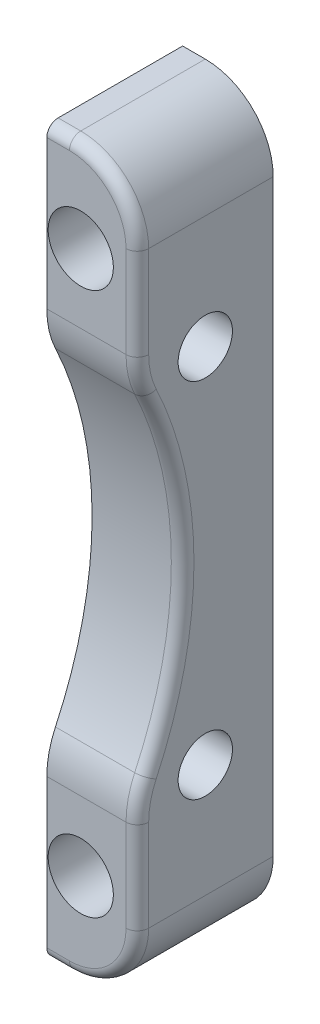
ISO-10303-21;
HEADER;
FILE_DESCRIPTION(('STEP AP214'),'2;1');
FILE_NAME('part.step','',(''),(''),'','','');
FILE_SCHEMA(('AUTOMOTIVE_DESIGN { 1 0 10303 214 1 1 1 1 }'));
ENDSEC;
DATA;
#1=APPLICATION_CONTEXT('core data for automotive mechanical design processes');
#2=APPLICATION_PROTOCOL_DEFINITION('international standard','automotive_design',2000,#1);
#3=PRODUCT_CONTEXT('',#1,'mechanical');
#4=PRODUCT('Part','Part','',(#3));
#5=PRODUCT_RELATED_PRODUCT_CATEGORY('part','',(#4));
#6=PRODUCT_DEFINITION_FORMATION('','',#4);
#7=PRODUCT_DEFINITION_CONTEXT('part definition',#1,'design');
#8=PRODUCT_DEFINITION('design','',#6,#7);
#9=PRODUCT_DEFINITION_SHAPE('','',#8);
#10=(LENGTH_UNIT() NAMED_UNIT(*) SI_UNIT(.MILLI.,.METRE.));
#11=(NAMED_UNIT(*) PLANE_ANGLE_UNIT() SI_UNIT($,.RADIAN.));
#12=(NAMED_UNIT(*) SI_UNIT($,.STERADIAN.) SOLID_ANGLE_UNIT());
#13=UNCERTAINTY_MEASURE_WITH_UNIT(LENGTH_MEASURE(1.E-05),#10,'distance_accuracy_value','');
#14=(GEOMETRIC_REPRESENTATION_CONTEXT(3) GLOBAL_UNCERTAINTY_ASSIGNED_CONTEXT((#13)) GLOBAL_UNIT_ASSIGNED_CONTEXT((#10,
#11,#12)) REPRESENTATION_CONTEXT('',''));
#15=CARTESIAN_POINT('',(0.,0.,0.));
#16=DIRECTION('',(0.,0.,1.));
#17=DIRECTION('',(1.,0.,0.));
#18=AXIS2_PLACEMENT_3D('',#15,#16,#17);
#19=CARTESIAN_POINT('',(6.35,-25.4,0.));
#20=DIRECTION('',(0.,1.,0.));
#21=DIRECTION('',(0.,0.,1.));
#22=AXIS2_PLACEMENT_3D('',#19,#20,#21);
#23=PLANE('',#22);
#24=DIRECTION('',(0.,0.,-1.));
#25=VECTOR('',#24,1.);
#26=CARTESIAN_POINT('',(1.5875,-25.4,0.));
#27=LINE('',#26,#25);
#28=CARTESIAN_POINT('',(1.5875,-25.4,0.));
#29=VERTEX_POINT('',#28);
#30=CARTESIAN_POINT('',(1.5875,-25.4,8.73125));
#31=VERTEX_POINT('',#30);
#32=EDGE_CURVE('E787',#29,#31,#27,.F.);
#33=ORIENTED_EDGE('',*,*,#32,.T.);
#34=DIRECTION('',(-1.,0.,0.));
#35=VECTOR('',#34,1.);
#36=CARTESIAN_POINT('',(6.35,-25.4,8.73125));
#37=LINE('',#36,#35);
#38=CARTESIAN_POINT('',(0.,-25.4,8.73125));
#39=VERTEX_POINT('',#38);
#40=EDGE_CURVE('E731',#31,#39,#37,.T.);
#41=ORIENTED_EDGE('',*,*,#40,.T.);
#42=DIRECTION('',(0.,0.,-1.));
#43=VECTOR('',#42,1.);
#44=CARTESIAN_POINT('',(0.,-25.4,0.));
#45=LINE('',#44,#43);
#46=CARTESIAN_POINT('',(0.,-25.4,0.));
#47=VERTEX_POINT('',#46);
#48=EDGE_CURVE('E725',#39,#47,#45,.T.);
#49=ORIENTED_EDGE('',*,*,#48,.T.);
#50=DIRECTION('',(-1.,0.,0.));
#51=VECTOR('',#50,1.);
#52=CARTESIAN_POINT('',(6.35,-25.4,0.));
#53=LINE('',#52,#51);
#54=EDGE_CURVE('E728',#29,#47,#53,.T.);
#55=ORIENTED_EDGE('',*,*,#54,.F.);
#56=EDGE_LOOP('',(#33,#41,#49,#55));
#57=FACE_BOUND('',#56,.T.);
#58=ADVANCED_FACE('F585',(#57),#23,.F.);
#59=CARTESIAN_POINT('',(6.35,-25.4,0.));
#60=DIRECTION('',(0.,0.,1.));
#61=DIRECTION('',(0.,-1.,0.));
#62=AXIS2_PLACEMENT_3D('',#59,#60,#61);
#63=PLANE('',#62);
#64=CARTESIAN_POINT('',(2.38125000000001,19.0499999999999,0.));
#65=DIRECTION('',(0.,0.,1.));
#66=DIRECTION('',(0.,-1.,0.));
#67=AXIS2_PLACEMENT_3D('',#64,#65,#66);
#68=CIRCLE('',#67,2.286);
#69=CARTESIAN_POINT('',(2.38125000000001,16.7639999999999,0.));
#70=VERTEX_POINT('',#69);
#71=EDGE_CURVE('E737',#70,#70,#68,.F.);
#72=ORIENTED_EDGE('',*,*,#71,.F.);
#73=EDGE_LOOP('',(#72));
#74=FACE_BOUND('',#73,.T.);
#75=CARTESIAN_POINT('',(2.38125000000001,-19.0499999999999,0.));
#76=DIRECTION('',(0.,0.,1.));
#77=DIRECTION('',(0.,-1.,0.));
#78=AXIS2_PLACEMENT_3D('',#75,#76,#77);
#79=CIRCLE('',#78,2.286);
#80=CARTESIAN_POINT('',(2.38125000000001,-21.3359999999999,0.));
#81=VERTEX_POINT('',#80);
#82=EDGE_CURVE('E924',#81,#81,#79,.F.);
#83=ORIENTED_EDGE('',*,*,#82,.F.);
#84=EDGE_LOOP('',(#83));
#85=FACE_BOUND('',#84,.T.);
#86=DIRECTION('',(0.,1.,0.));
#87=VECTOR('',#86,1.);
#88=CARTESIAN_POINT('',(6.35,-25.4,0.));
#89=LINE('',#88,#87);
#90=CARTESIAN_POINT('',(6.35,-20.6375,0.));
#91=VERTEX_POINT('',#90);
#92=CARTESIAN_POINT('',(6.35,20.6375,0.));
#93=VERTEX_POINT('',#92);
#94=EDGE_CURVE('E774',#91,#93,#89,.T.);
#95=ORIENTED_EDGE('',*,*,#94,.F.);
#96=CARTESIAN_POINT('',(1.5875,-20.6375,0.));
#97=DIRECTION('',(0.,0.,1.));
#98=DIRECTION('',(0.,-1.,0.));
#99=AXIS2_PLACEMENT_3D('',#96,#97,#98);
#100=CIRCLE('',#99,4.7625);
#101=EDGE_CURVE('E746',#91,#29,#100,.F.);
#102=ORIENTED_EDGE('',*,*,#101,.T.);
#103=ORIENTED_EDGE('',*,*,#54,.T.);
#104=DIRECTION('',(0.,1.,0.));
#105=VECTOR('',#104,1.);
#106=CARTESIAN_POINT('',(0.,-25.4,0.));
#107=LINE('',#106,#105);
#108=CARTESIAN_POINT('',(0.,25.4,0.));
#109=VERTEX_POINT('',#108);
#110=EDGE_CURVE('E736',#47,#109,#107,.T.);
#111=ORIENTED_EDGE('',*,*,#110,.T.);
#112=DIRECTION('',(-1.,0.,0.));
#113=VECTOR('',#112,1.);
#114=CARTESIAN_POINT('',(6.35,25.4,0.));
#115=LINE('',#114,#113);
#116=CARTESIAN_POINT('',(1.5875,25.4,0.));
#117=VERTEX_POINT('',#116);
#118=EDGE_CURVE('E749',#117,#109,#115,.T.);
#119=ORIENTED_EDGE('',*,*,#118,.F.);
#120=CARTESIAN_POINT('',(1.5875,20.6375,0.));
#121=DIRECTION('',(0.,0.,1.));
#122=DIRECTION('',(0.,-1.,0.));
#123=AXIS2_PLACEMENT_3D('',#120,#121,#122);
#124=CIRCLE('',#123,4.7625);
#125=EDGE_CURVE('E783',#117,#93,#124,.F.);
#126=ORIENTED_EDGE('',*,*,#125,.T.);
#127=EDGE_LOOP('',(#95,#102,#103,#111,#119,#126));
#128=FACE_BOUND('',#127,.T.);
#129=ADVANCED_FACE('F742',(#74,#85,#128),#63,.F.);
#130=CARTESIAN_POINT('',(6.35,25.4,0.));
#131=DIRECTION('',(0.,-1.,0.));
#132=DIRECTION('',(0.,0.,-1.));
#133=AXIS2_PLACEMENT_3D('',#130,#131,#132);
#134=PLANE('',#133);
#135=DIRECTION('',(0.,0.,1.));
#136=VECTOR('',#135,1.);
#137=CARTESIAN_POINT('',(0.,25.4,0.));
#138=LINE('',#137,#136);
#139=CARTESIAN_POINT('',(0.,25.4,8.73125000000001));
#140=VERTEX_POINT('',#139);
#141=EDGE_CURVE('E754',#109,#140,#138,.T.);
#142=ORIENTED_EDGE('',*,*,#141,.T.);
#143=DIRECTION('',(-1.,0.,0.));
#144=VECTOR('',#143,1.);
#145=CARTESIAN_POINT('',(6.35,25.4,8.73125000000001));
#146=LINE('',#145,#144);
#147=CARTESIAN_POINT('',(1.5875,25.4,8.73125000000001));
#148=VERTEX_POINT('',#147);
#149=EDGE_CURVE('E829',#140,#148,#146,.F.);
#150=ORIENTED_EDGE('',*,*,#149,.T.);
#151=DIRECTION('',(0.,0.,1.));
#152=VECTOR('',#151,1.);
#153=CARTESIAN_POINT('',(1.5875,25.4,0.));
#154=LINE('',#153,#152);
#155=EDGE_CURVE('E790',#148,#117,#154,.F.);
#156=ORIENTED_EDGE('',*,*,#155,.T.);
#157=ORIENTED_EDGE('',*,*,#118,.T.);
#158=EDGE_LOOP('',(#142,#150,#156,#157));
#159=FACE_BOUND('',#158,.T.);
#160=ADVANCED_FACE('F1006',(#159),#134,.F.);
#161=CARTESIAN_POINT('',(6.35,25.4,9.52500000000001));
#162=DIRECTION('',(0.,0.,-1.));
#163=DIRECTION('',(0.,1.,0.));
#164=AXIS2_PLACEMENT_3D('',#161,#162,#163);
#165=PLANE('',#164);
#166=CARTESIAN_POINT('',(2.38125000000001,19.0499999999999,9.52500000000001));
#167=DIRECTION('',(0.,0.,1.));
#168=DIRECTION('',(1.,0.,0.));
#169=AXIS2_PLACEMENT_3D('',#166,#167,#168);
#170=CIRCLE('',#169,2.286);
#171=CARTESIAN_POINT('',(4.66725000000001,19.0499999999999,9.52500000000001));
#172=VERTEX_POINT('',#171);
#173=EDGE_CURVE('E916',#172,#172,#170,.T.);
#174=ORIENTED_EDGE('',*,*,#173,.F.);
#175=EDGE_LOOP('',(#174));
#176=FACE_BOUND('',#175,.T.);
#177=CARTESIAN_POINT('',(1.5875,20.6375,9.52500000000001));
#178=DIRECTION('',(0.,0.,-1.));
#179=DIRECTION('',(0.,1.,0.));
#180=AXIS2_PLACEMENT_3D('',#177,#178,#179);
#181=CIRCLE('',#180,3.96875);
#182=CARTESIAN_POINT('',(5.55625,20.6375,9.52500000000001));
#183=VERTEX_POINT('',#182);
#184=CARTESIAN_POINT('',(1.5875,24.60625,9.52500000000001));
#185=VERTEX_POINT('',#184);
#186=EDGE_CURVE('E816',#183,#185,#181,.F.);
#187=ORIENTED_EDGE('',*,*,#186,.T.);
#188=DIRECTION('',(-1.,0.,0.));
#189=VECTOR('',#188,1.);
#190=CARTESIAN_POINT('',(6.35,24.60625,9.52500000000001));
#191=LINE('',#190,#189);
#192=CARTESIAN_POINT('',(0.,24.60625,9.52500000000001));
#193=VERTEX_POINT('',#192);
#194=EDGE_CURVE('E819',#185,#193,#191,.T.);
#195=ORIENTED_EDGE('',*,*,#194,.T.);
#196=DIRECTION('',(0.,-1.,0.));
#197=VECTOR('',#196,1.);
#198=CARTESIAN_POINT('',(0.,25.4,9.52500000000001));
#199=LINE('',#198,#197);
#200=CARTESIAN_POINT('',(0.,14.1990316571237,9.52500000000001));
#201=VERTEX_POINT('',#200);
#202=EDGE_CURVE('E760',#193,#201,#199,.T.);
#203=ORIENTED_EDGE('',*,*,#202,.T.);
#204=DIRECTION('',(-1.,0.,0.));
#205=VECTOR('',#204,1.);
#206=CARTESIAN_POINT('',(6.35,14.1990316571237,9.52500000000001));
#207=LINE('',#206,#205);
#208=CARTESIAN_POINT('',(5.55625,14.1990316571237,9.52500000000001));
#209=VERTEX_POINT('',#208);
#210=EDGE_CURVE('E809',#201,#209,#207,.F.);
#211=ORIENTED_EDGE('',*,*,#210,.T.);
#212=DIRECTION('',(0.,-1.,0.));
#213=VECTOR('',#212,1.);
#214=CARTESIAN_POINT('',(5.55625,25.4,9.52500000000001));
#215=LINE('',#214,#213);
#216=EDGE_CURVE('E813',#209,#183,#215,.F.);
#217=ORIENTED_EDGE('',*,*,#216,.T.);
#218=EDGE_LOOP('',(#187,#195,#203,#211,#217));
#219=FACE_BOUND('',#218,.T.);
#220=ADVANCED_FACE('F953',(#176,#219),#165,.F.);
#221=CARTESIAN_POINT('',(6.35,0.,33.3374999999999));
#222=DIRECTION('',(-1.,0.,0.));
#223=DIRECTION('',(0.,0.,1.));
#224=AXIS2_PLACEMENT_3D('',#221,#222,#223);
#225=CYLINDRICAL_SURFACE('',#224,26.9875);
#226=DIRECTION('',(-1.,0.,0.));
#227=VECTOR('',#226,1.);
#228=CARTESIAN_POINT('',(6.35,-11.4944541986239,8.92023809523809));
#229=LINE('',#228,#227);
#230=CARTESIAN_POINT('',(0.,-11.4944541986239,8.92023809523809));
#231=VERTEX_POINT('',#230);
#232=CARTESIAN_POINT('',(5.55625,-11.4944541986239,8.92023809523809));
#233=VERTEX_POINT('',#232);
#234=EDGE_CURVE('E806',#231,#233,#229,.F.);
#235=ORIENTED_EDGE('',*,*,#234,.T.);
#236=CARTESIAN_POINT('',(5.55625,0.,33.3374999999999));
#237=DIRECTION('',(-1.,0.,0.));
#238=DIRECTION('',(0.,0.,1.));
#239=AXIS2_PLACEMENT_3D('',#236,#237,#238);
#240=CIRCLE('',#239,26.9875);
#241=CARTESIAN_POINT('',(5.55625,11.4944541986239,8.9202380952381));
#242=VERTEX_POINT('',#241);
#243=EDGE_CURVE('E595',#233,#242,#240,.F.);
#244=ORIENTED_EDGE('',*,*,#243,.T.);
#245=DIRECTION('',(-1.,0.,0.));
#246=VECTOR('',#245,1.);
#247=CARTESIAN_POINT('',(6.35,11.4944541986239,8.9202380952381));
#248=LINE('',#247,#246);
#249=CARTESIAN_POINT('',(0.,11.4944541986239,8.9202380952381));
#250=VERTEX_POINT('',#249);
#251=EDGE_CURVE('E803',#242,#250,#248,.T.);
#252=ORIENTED_EDGE('',*,*,#251,.T.);
#253=CARTESIAN_POINT('',(0.,0.,33.3374999999999));
#254=DIRECTION('',(-1.,0.,0.));
#255=DIRECTION('',(0.,0.,1.));
#256=AXIS2_PLACEMENT_3D('',#253,#254,#255);
#257=CIRCLE('',#256,26.9875);
#258=EDGE_CURVE('E766',#250,#231,#257,.T.);
#259=ORIENTED_EDGE('',*,*,#258,.T.);
#260=EDGE_LOOP('',(#235,#244,#252,#259));
#261=FACE_BOUND('',#260,.T.);
#262=ADVANCED_FACE('F1014',(#261),#225,.F.);
#263=CARTESIAN_POINT('',(6.35,-25.4,9.525));
#264=DIRECTION('',(0.,0.,-1.));
#265=DIRECTION('',(0.,1.,0.));
#266=AXIS2_PLACEMENT_3D('',#263,#264,#265);
#267=PLANE('',#266);
#268=CARTESIAN_POINT('',(2.38125000000001,-19.0499999999999,9.52500000000001));
#269=DIRECTION('',(0.,0.,1.));
#270=DIRECTION('',(1.,0.,0.));
#271=AXIS2_PLACEMENT_3D('',#268,#269,#270);
#272=CIRCLE('',#271,2.286);
#273=CARTESIAN_POINT('',(4.66725000000001,-19.0499999999999,9.52500000000001));
#274=VERTEX_POINT('',#273);
#275=EDGE_CURVE('E920',#274,#274,#272,.T.);
#276=ORIENTED_EDGE('',*,*,#275,.F.);
#277=EDGE_LOOP('',(#276));
#278=FACE_BOUND('',#277,.T.);
#279=DIRECTION('',(0.,-1.,0.));
#280=VECTOR('',#279,1.);
#281=CARTESIAN_POINT('',(0.,-25.4,9.525));
#282=LINE('',#281,#280);
#283=CARTESIAN_POINT('',(0.,-14.1990316571237,9.525));
#284=VERTEX_POINT('',#283);
#285=CARTESIAN_POINT('',(0.,-24.60625,9.525));
#286=VERTEX_POINT('',#285);
#287=EDGE_CURVE('E770',#284,#286,#282,.T.);
#288=ORIENTED_EDGE('',*,*,#287,.T.);
#289=DIRECTION('',(-1.,0.,0.));
#290=VECTOR('',#289,1.);
#291=CARTESIAN_POINT('',(6.35,-24.60625,9.525));
#292=LINE('',#291,#290);
#293=CARTESIAN_POINT('',(1.5875,-24.60625,9.525));
#294=VERTEX_POINT('',#293);
#295=EDGE_CURVE('E843',#286,#294,#292,.F.);
#296=ORIENTED_EDGE('',*,*,#295,.T.);
#297=CARTESIAN_POINT('',(1.5875,-20.6375,9.525));
#298=DIRECTION('',(0.,0.,-1.));
#299=DIRECTION('',(0.,1.,0.));
#300=AXIS2_PLACEMENT_3D('',#297,#298,#299);
#301=CIRCLE('',#300,3.96875);
#302=CARTESIAN_POINT('',(5.55625,-20.6375,9.525));
#303=VERTEX_POINT('',#302);
#304=EDGE_CURVE('E840',#294,#303,#301,.F.);
#305=ORIENTED_EDGE('',*,*,#304,.T.);
#306=DIRECTION('',(0.,-1.,0.));
#307=VECTOR('',#306,1.);
#308=CARTESIAN_POINT('',(5.55625,-25.4,9.525));
#309=LINE('',#308,#307);
#310=CARTESIAN_POINT('',(5.55625,-14.1990316571237,9.525));
#311=VERTEX_POINT('',#310);
#312=EDGE_CURVE('E837',#303,#311,#309,.F.);
#313=ORIENTED_EDGE('',*,*,#312,.T.);
#314=DIRECTION('',(-1.,0.,0.));
#315=VECTOR('',#314,1.);
#316=CARTESIAN_POINT('',(6.35,-14.1990316571237,9.525));
#317=LINE('',#316,#315);
#318=EDGE_CURVE('E793',#311,#284,#317,.T.);
#319=ORIENTED_EDGE('',*,*,#318,.T.);
#320=EDGE_LOOP('',(#288,#296,#305,#313,#319));
#321=FACE_BOUND('',#320,.T.);
#322=ADVANCED_FACE('F978',(#278,#321),#267,.F.);
#323=CARTESIAN_POINT('',(6.35,0.,33.3374999999999));
#324=DIRECTION('',(-1.,0.,0.));
#325=DIRECTION('',(0.,0.,1.));
#326=AXIS2_PLACEMENT_3D('',#323,#324,#325);
#327=PLANE('',#326);
#328=CARTESIAN_POINT('',(6.35,12.7,4.76250000000001));
#329=DIRECTION('',(1.,0.,0.));
#330=DIRECTION('',(0.,0.,-1.));
#331=AXIS2_PLACEMENT_3D('',#328,#329,#330);
#332=CIRCLE('',#331,1.905);
#333=CARTESIAN_POINT('',(6.35,12.7,2.85750000000001));
#334=VERTEX_POINT('',#333);
#335=EDGE_CURVE('E928',#334,#334,#332,.T.);
#336=ORIENTED_EDGE('',*,*,#335,.F.);
#337=EDGE_LOOP('',(#336));
#338=FACE_BOUND('',#337,.T.);
#339=CARTESIAN_POINT('',(6.35,-12.7,4.76250000000001));
#340=DIRECTION('',(1.,0.,0.));
#341=DIRECTION('',(0.,0.,-1.));
#342=AXIS2_PLACEMENT_3D('',#339,#340,#341);
#343=CIRCLE('',#342,1.905);
#344=CARTESIAN_POINT('',(6.35,-12.7,2.85750000000001));
#345=VERTEX_POINT('',#344);
#346=EDGE_CURVE('E899',#345,#345,#343,.T.);
#347=ORIENTED_EDGE('',*,*,#346,.F.);
#348=EDGE_LOOP('',(#347));
#349=FACE_BOUND('',#348,.T.);
#350=CARTESIAN_POINT('',(6.35,-14.1990316571237,3.175));
#351=DIRECTION('',(-1.,0.,0.));
#352=DIRECTION('',(0.,0.,1.));
#353=AXIS2_PLACEMENT_3D('',#350,#351,#352);
#354=CIRCLE('',#353,5.55625);
#355=CARTESIAN_POINT('',(6.35,-11.8325263809364,8.20208333333333));
#356=VERTEX_POINT('',#355);
#357=CARTESIAN_POINT('',(6.35,-14.1990316571237,8.73125));
#358=VERTEX_POINT('',#357);
#359=EDGE_CURVE('E857',#356,#358,#354,.F.);
#360=ORIENTED_EDGE('',*,*,#359,.T.);
#361=DIRECTION('',(0.,-1.,0.));
#362=VECTOR('',#361,1.);
#363=CARTESIAN_POINT('',(6.35,0.,8.73125));
#364=LINE('',#363,#362);
#365=CARTESIAN_POINT('',(6.35,-20.6375,8.73125));
#366=VERTEX_POINT('',#365);
#367=EDGE_CURVE('E860',#358,#366,#364,.T.);
#368=ORIENTED_EDGE('',*,*,#367,.T.);
#369=DIRECTION('',(0.,0.,-1.));
#370=VECTOR('',#369,1.);
#371=CARTESIAN_POINT('',(6.35,-20.6375,33.3374999999999));
#372=LINE('',#371,#370);
#373=EDGE_CURVE('E780',#366,#91,#372,.T.);
#374=ORIENTED_EDGE('',*,*,#373,.T.);
#375=ORIENTED_EDGE('',*,*,#94,.T.);
#376=DIRECTION('',(0.,0.,1.));
#377=VECTOR('',#376,1.);
#378=CARTESIAN_POINT('',(6.35,20.6375,33.3374999999999));
#379=LINE('',#378,#377);
#380=CARTESIAN_POINT('',(6.35,20.6375,8.73125000000001));
#381=VERTEX_POINT('',#380);
#382=EDGE_CURVE('E748',#93,#381,#379,.T.);
#383=ORIENTED_EDGE('',*,*,#382,.T.);
#384=DIRECTION('',(0.,-1.,0.));
#385=VECTOR('',#384,1.);
#386=CARTESIAN_POINT('',(6.35,0.,8.73125000000001));
#387=LINE('',#386,#385);
#388=CARTESIAN_POINT('',(6.35,14.1990316571237,8.73125000000001));
#389=VERTEX_POINT('',#388);
#390=EDGE_CURVE('E849',#381,#389,#387,.T.);
#391=ORIENTED_EDGE('',*,*,#390,.T.);
#392=CARTESIAN_POINT('',(6.35,14.1990316571237,3.17500000000001));
#393=DIRECTION('',(-1.,0.,0.));
#394=DIRECTION('',(0.,0.,1.));
#395=AXIS2_PLACEMENT_3D('',#392,#393,#394);
#396=CIRCLE('',#395,5.55625);
#397=CARTESIAN_POINT('',(6.35,11.8325263809364,8.20208333333334));
#398=VERTEX_POINT('',#397);
#399=EDGE_CURVE('E852',#389,#398,#396,.F.);
#400=ORIENTED_EDGE('',*,*,#399,.T.);
#401=CARTESIAN_POINT('',(6.35,0.,33.3374999999999));
#402=DIRECTION('',(-1.,0.,0.));
#403=DIRECTION('',(0.,0.,1.));
#404=AXIS2_PLACEMENT_3D('',#401,#402,#403);
#405=CIRCLE('',#404,27.78125);
#406=EDGE_CURVE('E855',#398,#356,#405,.T.);
#407=ORIENTED_EDGE('',*,*,#406,.T.);
#408=EDGE_LOOP('',(#360,#368,#374,#375,#383,#391,#400,#407));
#409=FACE_BOUND('',#408,.T.);
#410=ADVANCED_FACE('F935',(#338,#349,#409),#327,.F.);
#411=CARTESIAN_POINT('',(0.,0.,33.3374999999999));
#412=DIRECTION('',(-1.,0.,0.));
#413=DIRECTION('',(0.,0.,1.));
#414=AXIS2_PLACEMENT_3D('',#411,#412,#413);
#415=PLANE('',#414);
#416=CARTESIAN_POINT('',(0.,12.7,4.76250000000001));
#417=DIRECTION('',(-1.,0.,0.));
#418=DIRECTION('',(0.,0.,1.));
#419=AXIS2_PLACEMENT_3D('',#416,#417,#418);
#420=CIRCLE('',#419,1.905);
#421=CARTESIAN_POINT('',(0.,12.7,6.66750000000001));
#422=VERTEX_POINT('',#421);
#423=EDGE_CURVE('E912',#422,#422,#420,.F.);
#424=ORIENTED_EDGE('',*,*,#423,.T.);
#425=EDGE_LOOP('',(#424));
#426=FACE_BOUND('',#425,.T.);
#427=CARTESIAN_POINT('',(0.,-12.7,4.76250000000001));
#428=DIRECTION('',(-1.,0.,0.));
#429=DIRECTION('',(0.,0.,1.));
#430=AXIS2_PLACEMENT_3D('',#427,#428,#429);
#431=CIRCLE('',#430,1.905);
#432=CARTESIAN_POINT('',(0.,-12.7,6.66750000000001));
#433=VERTEX_POINT('',#432);
#434=EDGE_CURVE('E906',#433,#433,#431,.F.);
#435=ORIENTED_EDGE('',*,*,#434,.T.);
#436=EDGE_LOOP('',(#435));
#437=FACE_BOUND('',#436,.T.);
#438=ORIENTED_EDGE('',*,*,#202,.F.);
#439=CARTESIAN_POINT('',(0.,24.60625,8.73125000000001));
#440=DIRECTION('',(-1.,0.,0.));
#441=DIRECTION('',(0.,0.,1.));
#442=AXIS2_PLACEMENT_3D('',#439,#440,#441);
#443=CIRCLE('',#442,0.79375);
#444=EDGE_CURVE('E826',#193,#140,#443,.T.);
#445=ORIENTED_EDGE('',*,*,#444,.T.);
#446=ORIENTED_EDGE('',*,*,#141,.F.);
#447=ORIENTED_EDGE('',*,*,#110,.F.);
#448=ORIENTED_EDGE('',*,*,#48,.F.);
#449=CARTESIAN_POINT('',(0.,-24.60625,8.73125));
#450=DIRECTION('',(-1.,0.,0.));
#451=DIRECTION('',(0.,0.,1.));
#452=AXIS2_PLACEMENT_3D('',#449,#450,#451);
#453=CIRCLE('',#452,0.79375);
#454=EDGE_CURVE('E823',#39,#286,#453,.T.);
#455=ORIENTED_EDGE('',*,*,#454,.T.);
#456=ORIENTED_EDGE('',*,*,#287,.F.);
#457=CARTESIAN_POINT('',(0.,-14.1990316571237,3.175));
#458=DIRECTION('',(-1.,0.,0.));
#459=DIRECTION('',(0.,0.,1.));
#460=AXIS2_PLACEMENT_3D('',#457,#458,#459);
#461=CIRCLE('',#460,6.35);
#462=EDGE_CURVE('E800',#284,#231,#461,.T.);
#463=ORIENTED_EDGE('',*,*,#462,.T.);
#464=ORIENTED_EDGE('',*,*,#258,.F.);
#465=CARTESIAN_POINT('',(0.,14.1990316571237,3.17500000000001));
#466=DIRECTION('',(-1.,0.,0.));
#467=DIRECTION('',(0.,0.,1.));
#468=AXIS2_PLACEMENT_3D('',#465,#466,#467);
#469=CIRCLE('',#468,6.35);
#470=EDGE_CURVE('E796',#250,#201,#469,.T.);
#471=ORIENTED_EDGE('',*,*,#470,.T.);
#472=EDGE_LOOP('',(#438,#445,#446,#447,#448,#455,#456,#463,#464,#471));
#473=FACE_BOUND('',#472,.T.);
#474=ADVANCED_FACE('F752',(#426,#437,#473),#415,.T.);
#475=CARTESIAN_POINT('',(2.38125000000001,-19.0499999999999,-0.000999999999999265));
#476=DIRECTION('',(0.,0.,1.));
#477=DIRECTION('',(1.,0.,0.));
#478=AXIS2_PLACEMENT_3D('',#475,#476,#477);
#479=CYLINDRICAL_SURFACE('',#478,2.286);
#480=ORIENTED_EDGE('',*,*,#275,.T.);
#481=EDGE_LOOP('',(#480));
#482=FACE_BOUND('',#481,.T.);
#483=ORIENTED_EDGE('',*,*,#82,.T.);
#484=EDGE_LOOP('',(#483));
#485=FACE_BOUND('',#484,.T.);
#486=ADVANCED_FACE('F1023',(#482,#485),#479,.F.);
#487=CARTESIAN_POINT('',(2.38125000000001,19.0499999999999,-0.000999999999999265));
#488=DIRECTION('',(0.,0.,1.));
#489=DIRECTION('',(1.,0.,0.));
#490=AXIS2_PLACEMENT_3D('',#487,#488,#489);
#491=CYLINDRICAL_SURFACE('',#490,2.286);
#492=ORIENTED_EDGE('',*,*,#173,.T.);
#493=EDGE_LOOP('',(#492));
#494=FACE_BOUND('',#493,.T.);
#495=ORIENTED_EDGE('',*,*,#71,.T.);
#496=EDGE_LOOP('',(#495));
#497=FACE_BOUND('',#496,.T.);
#498=ADVANCED_FACE('F1030',(#494,#497),#491,.F.);
#499=CARTESIAN_POINT('',(-0.00100000000000013,-12.7,4.76250000000001));
#500=DIRECTION('',(1.,0.,0.));
#501=DIRECTION('',(0.,0.,-1.));
#502=AXIS2_PLACEMENT_3D('',#499,#500,#501);
#503=CYLINDRICAL_SURFACE('',#502,1.905);
#504=ORIENTED_EDGE('',*,*,#434,.F.);
#505=EDGE_LOOP('',(#504));
#506=FACE_BOUND('',#505,.T.);
#507=ORIENTED_EDGE('',*,*,#346,.T.);
#508=EDGE_LOOP('',(#507));
#509=FACE_BOUND('',#508,.T.);
#510=ADVANCED_FACE('F996',(#506,#509),#503,.F.);
#511=CARTESIAN_POINT('',(-0.00100000000000013,12.7,4.76250000000001));
#512=DIRECTION('',(1.,0.,0.));
#513=DIRECTION('',(0.,0.,-1.));
#514=AXIS2_PLACEMENT_3D('',#511,#512,#513);
#515=CYLINDRICAL_SURFACE('',#514,1.905);
#516=ORIENTED_EDGE('',*,*,#423,.F.);
#517=EDGE_LOOP('',(#516));
#518=FACE_BOUND('',#517,.T.);
#519=ORIENTED_EDGE('',*,*,#335,.T.);
#520=EDGE_LOOP('',(#519));
#521=FACE_BOUND('',#520,.T.);
#522=ADVANCED_FACE('F988',(#518,#521),#515,.F.);
#523=CARTESIAN_POINT('',(1.5875,-20.6375,33.3374999999999));
#524=DIRECTION('',(0.,0.,-1.));
#525=DIRECTION('',(-1.,0.,0.));
#526=AXIS2_PLACEMENT_3D('',#523,#524,#525);
#527=CYLINDRICAL_SURFACE('',#526,4.7625);
#528=ORIENTED_EDGE('',*,*,#373,.F.);
#529=CARTESIAN_POINT('',(1.5875,-20.6375,8.73125));
#530=DIRECTION('',(0.,0.,-1.));
#531=DIRECTION('',(0.,1.,0.));
#532=AXIS2_PLACEMENT_3D('',#529,#530,#531);
#533=CIRCLE('',#532,4.7625);
#534=EDGE_CURVE('E846',#366,#31,#533,.T.);
#535=ORIENTED_EDGE('',*,*,#534,.T.);
#536=ORIENTED_EDGE('',*,*,#32,.F.);
#537=ORIENTED_EDGE('',*,*,#101,.F.);
#538=EDGE_LOOP('',(#528,#535,#536,#537));
#539=FACE_BOUND('',#538,.T.);
#540=ADVANCED_FACE('F986',(#539),#527,.T.);
#541=CARTESIAN_POINT('',(1.5875,20.6375,33.3374999999999));
#542=DIRECTION('',(0.,0.,1.));
#543=DIRECTION('',(1.,0.,0.));
#544=AXIS2_PLACEMENT_3D('',#541,#542,#543);
#545=CYLINDRICAL_SURFACE('',#544,4.7625);
#546=ORIENTED_EDGE('',*,*,#155,.F.);
#547=CARTESIAN_POINT('',(1.5875,20.6375,8.73125000000001));
#548=DIRECTION('',(0.,0.,-1.));
#549=DIRECTION('',(0.,1.,0.));
#550=AXIS2_PLACEMENT_3D('',#547,#548,#549);
#551=CIRCLE('',#550,4.7625);
#552=EDGE_CURVE('E832',#148,#381,#551,.T.);
#553=ORIENTED_EDGE('',*,*,#552,.T.);
#554=ORIENTED_EDGE('',*,*,#382,.F.);
#555=ORIENTED_EDGE('',*,*,#125,.F.);
#556=EDGE_LOOP('',(#546,#553,#554,#555));
#557=FACE_BOUND('',#556,.T.);
#558=ADVANCED_FACE('F941',(#557),#545,.T.);
#559=CARTESIAN_POINT('',(6.35,-14.1990316571237,3.175));
#560=DIRECTION('',(-1.,0.,0.));
#561=DIRECTION('',(0.,0.,1.));
#562=AXIS2_PLACEMENT_3D('',#559,#560,#561);
#563=CYLINDRICAL_SURFACE('',#562,6.35);
#564=ORIENTED_EDGE('',*,*,#318,.F.);
#565=CARTESIAN_POINT('',(5.55625,-14.1990316571237,3.175));
#566=DIRECTION('',(-1.,0.,0.));
#567=DIRECTION('',(0.,0.,1.));
#568=AXIS2_PLACEMENT_3D('',#565,#566,#567);
#569=CIRCLE('',#568,6.35);
#570=EDGE_CURVE('E616',#311,#233,#569,.T.);
#571=ORIENTED_EDGE('',*,*,#570,.T.);
#572=ORIENTED_EDGE('',*,*,#234,.F.);
#573=ORIENTED_EDGE('',*,*,#462,.F.);
#574=EDGE_LOOP('',(#564,#571,#572,#573));
#575=FACE_BOUND('',#574,.T.);
#576=ADVANCED_FACE('F980',(#575),#563,.T.);
#577=CARTESIAN_POINT('',(6.35,14.1990316571237,3.17500000000001));
#578=DIRECTION('',(-1.,0.,0.));
#579=DIRECTION('',(0.,0.,1.));
#580=AXIS2_PLACEMENT_3D('',#577,#578,#579);
#581=CYLINDRICAL_SURFACE('',#580,6.35);
#582=ORIENTED_EDGE('',*,*,#251,.F.);
#583=CARTESIAN_POINT('',(5.55625,14.1990316571237,3.17500000000001));
#584=DIRECTION('',(-1.,0.,0.));
#585=DIRECTION('',(0.,0.,1.));
#586=AXIS2_PLACEMENT_3D('',#583,#584,#585);
#587=CIRCLE('',#586,6.35);
#588=EDGE_CURVE('E12',#242,#209,#587,.T.);
#589=ORIENTED_EDGE('',*,*,#588,.T.);
#590=ORIENTED_EDGE('',*,*,#210,.F.);
#591=ORIENTED_EDGE('',*,*,#470,.F.);
#592=EDGE_LOOP('',(#582,#589,#590,#591));
#593=FACE_BOUND('',#592,.T.);
#594=ADVANCED_FACE('F958',(#593),#581,.T.);
#595=CARTESIAN_POINT('',(6.35,-24.60625,8.73125));
#596=DIRECTION('',(-1.,0.,0.));
#597=DIRECTION('',(0.,0.,1.));
#598=AXIS2_PLACEMENT_3D('',#595,#596,#597);
#599=CYLINDRICAL_SURFACE('',#598,0.79375);
#600=ORIENTED_EDGE('',*,*,#454,.F.);
#601=ORIENTED_EDGE('',*,*,#40,.F.);
#602=CARTESIAN_POINT('',(1.5875,-24.60625,8.73125));
#603=DIRECTION('',(1.,0.,0.));
#604=DIRECTION('',(0.,0.,-1.));
#605=AXIS2_PLACEMENT_3D('',#602,#603,#604);
#606=CIRCLE('',#605,0.79375);
#607=EDGE_CURVE('E589',#294,#31,#606,.T.);
#608=ORIENTED_EDGE('',*,*,#607,.F.);
#609=ORIENTED_EDGE('',*,*,#295,.F.);
#610=EDGE_LOOP('',(#600,#601,#608,#609));
#611=FACE_BOUND('',#610,.T.);
#612=ADVANCED_FACE('F587',(#611),#599,.T.);
#613=CARTESIAN_POINT('',(1.5875,-20.6375,8.73125));
#614=DIRECTION('',(0.,0.,-1.));
#615=DIRECTION('',(0.,1.,0.));
#616=AXIS2_PLACEMENT_3D('',#613,#614,#615);
#617=TOROIDAL_SURFACE('',#616,3.96875,0.79375);
#618=ORIENTED_EDGE('',*,*,#607,.T.);
#619=ORIENTED_EDGE('',*,*,#534,.F.);
#620=CARTESIAN_POINT('',(5.55625,-20.6375,8.73125));
#621=DIRECTION('',(0.,1.,0.));
#622=DIRECTION('',(0.,0.,1.));
#623=AXIS2_PLACEMENT_3D('',#620,#621,#622);
#624=CIRCLE('',#623,0.79375);
#625=EDGE_CURVE('E890',#303,#366,#624,.T.);
#626=ORIENTED_EDGE('',*,*,#625,.F.);
#627=ORIENTED_EDGE('',*,*,#304,.F.);
#628=EDGE_LOOP('',(#618,#619,#626,#627));
#629=FACE_BOUND('',#628,.T.);
#630=ADVANCED_FACE('F984',(#629),#617,.T.);
#631=CARTESIAN_POINT('',(5.55625,0.,8.73125));
#632=DIRECTION('',(0.,-1.,0.));
#633=DIRECTION('',(0.,0.,-1.));
#634=AXIS2_PLACEMENT_3D('',#631,#632,#633);
#635=CYLINDRICAL_SURFACE('',#634,0.79375);
#636=ORIENTED_EDGE('',*,*,#625,.T.);
#637=ORIENTED_EDGE('',*,*,#367,.F.);
#638=CARTESIAN_POINT('',(5.55625,-14.1990316571237,8.73125));
#639=DIRECTION('',(0.,1.,0.));
#640=DIRECTION('',(0.,0.,1.));
#641=AXIS2_PLACEMENT_3D('',#638,#639,#640);
#642=CIRCLE('',#641,0.79375);
#643=EDGE_CURVE('E887',#311,#358,#642,.T.);
#644=ORIENTED_EDGE('',*,*,#643,.F.);
#645=ORIENTED_EDGE('',*,*,#312,.F.);
#646=EDGE_LOOP('',(#636,#637,#644,#645));
#647=FACE_BOUND('',#646,.T.);
#648=ADVANCED_FACE('F976',(#647),#635,.T.);
#649=CARTESIAN_POINT('',(5.55625,-14.1990316571237,3.175));
#650=DIRECTION('',(-1.,0.,0.));
#651=DIRECTION('',(0.,0.,1.));
#652=AXIS2_PLACEMENT_3D('',#649,#650,#651);
#653=TOROIDAL_SURFACE('',#652,5.55625,0.79375);
#654=ORIENTED_EDGE('',*,*,#643,.T.);
#655=ORIENTED_EDGE('',*,*,#359,.F.);
#656=CARTESIAN_POINT('',(5.55625,-11.8325263809364,8.20208333333333));
#657=DIRECTION('',(0.,0.904761904761904,-0.425917709999961));
#658=DIRECTION('',(0.,0.425917709999961,0.904761904761905));
#659=AXIS2_PLACEMENT_3D('',#656,#657,#658);
#660=CIRCLE('',#659,0.79375);
#661=EDGE_CURVE('E883',#233,#356,#660,.T.);
#662=ORIENTED_EDGE('',*,*,#661,.F.);
#663=ORIENTED_EDGE('',*,*,#570,.F.);
#664=EDGE_LOOP('',(#654,#655,#662,#663));
#665=FACE_BOUND('',#664,.T.);
#666=ADVANCED_FACE('F974',(#665),#653,.T.);
#667=CARTESIAN_POINT('',(5.55625,0.,33.3374999999999));
#668=DIRECTION('',(-1.,0.,0.));
#669=DIRECTION('',(0.,0.,1.));
#670=AXIS2_PLACEMENT_3D('',#667,#668,#669);
#671=TOROIDAL_SURFACE('',#670,27.78125,0.79375);
#672=ORIENTED_EDGE('',*,*,#661,.T.);
#673=ORIENTED_EDGE('',*,*,#406,.F.);
#674=CARTESIAN_POINT('',(5.55625,11.8325263809364,8.20208333333334));
#675=DIRECTION('',(0.,0.904761904761904,0.425917709999961));
#676=DIRECTION('',(0.,-0.425917709999961,0.904761904761905));
#677=AXIS2_PLACEMENT_3D('',#674,#675,#676);
#678=CIRCLE('',#677,0.79375);
#679=EDGE_CURVE('E879',#242,#398,#678,.T.);
#680=ORIENTED_EDGE('',*,*,#679,.F.);
#681=ORIENTED_EDGE('',*,*,#243,.F.);
#682=EDGE_LOOP('',(#672,#673,#680,#681));
#683=FACE_BOUND('',#682,.T.);
#684=ADVANCED_FACE('F971',(#683),#671,.T.);
#685=CARTESIAN_POINT('',(5.55625,14.1990316571237,3.17500000000001));
#686=DIRECTION('',(-1.,0.,0.));
#687=DIRECTION('',(0.,0.,1.));
#688=AXIS2_PLACEMENT_3D('',#685,#686,#687);
#689=TOROIDAL_SURFACE('',#688,5.55625,0.79375);
#690=ORIENTED_EDGE('',*,*,#679,.T.);
#691=ORIENTED_EDGE('',*,*,#399,.F.);
#692=CARTESIAN_POINT('',(5.55625,14.1990316571237,8.73125000000001));
#693=DIRECTION('',(0.,1.,0.));
#694=DIRECTION('',(0.,0.,1.));
#695=AXIS2_PLACEMENT_3D('',#692,#693,#694);
#696=CIRCLE('',#695,0.79375);
#697=EDGE_CURVE('E875',#209,#389,#696,.T.);
#698=ORIENTED_EDGE('',*,*,#697,.F.);
#699=ORIENTED_EDGE('',*,*,#588,.F.);
#700=EDGE_LOOP('',(#690,#691,#698,#699));
#701=FACE_BOUND('',#700,.T.);
#702=ADVANCED_FACE('F964',(#701),#689,.T.);
#703=CARTESIAN_POINT('',(5.55625,0.,8.73125000000001));
#704=DIRECTION('',(0.,-1.,0.));
#705=DIRECTION('',(0.,0.,-1.));
#706=AXIS2_PLACEMENT_3D('',#703,#704,#705);
#707=CYLINDRICAL_SURFACE('',#706,0.79375);
#708=ORIENTED_EDGE('',*,*,#697,.T.);
#709=ORIENTED_EDGE('',*,*,#390,.F.);
#710=CARTESIAN_POINT('',(5.55625,20.6375,8.73125000000001));
#711=DIRECTION('',(0.,1.,0.));
#712=DIRECTION('',(0.,0.,1.));
#713=AXIS2_PLACEMENT_3D('',#710,#711,#712);
#714=CIRCLE('',#713,0.79375);
#715=EDGE_CURVE('E871',#183,#381,#714,.T.);
#716=ORIENTED_EDGE('',*,*,#715,.F.);
#717=ORIENTED_EDGE('',*,*,#216,.F.);
#718=EDGE_LOOP('',(#708,#709,#716,#717));
#719=FACE_BOUND('',#718,.T.);
#720=ADVANCED_FACE('F966',(#719),#707,.T.);
#721=CARTESIAN_POINT('',(1.5875,20.6375,8.73125000000001));
#722=DIRECTION('',(0.,0.,-1.));
#723=DIRECTION('',(0.,1.,0.));
#724=AXIS2_PLACEMENT_3D('',#721,#722,#723);
#725=TOROIDAL_SURFACE('',#724,3.96875,0.79375);
#726=ORIENTED_EDGE('',*,*,#715,.T.);
#727=ORIENTED_EDGE('',*,*,#552,.F.);
#728=CARTESIAN_POINT('',(1.5875,24.60625,8.73125000000001));
#729=DIRECTION('',(-1.,0.,0.));
#730=DIRECTION('',(0.,0.,1.));
#731=AXIS2_PLACEMENT_3D('',#728,#729,#730);
#732=CIRCLE('',#731,0.79375);
#733=EDGE_CURVE('E867',#185,#148,#732,.T.);
#734=ORIENTED_EDGE('',*,*,#733,.F.);
#735=ORIENTED_EDGE('',*,*,#186,.F.);
#736=EDGE_LOOP('',(#726,#727,#734,#735));
#737=FACE_BOUND('',#736,.T.);
#738=ADVANCED_FACE('F945',(#737),#725,.T.);
#739=CARTESIAN_POINT('',(6.35,24.60625,8.73125000000001));
#740=DIRECTION('',(-1.,0.,0.));
#741=DIRECTION('',(0.,0.,1.));
#742=AXIS2_PLACEMENT_3D('',#739,#740,#741);
#743=CYLINDRICAL_SURFACE('',#742,0.79375);
#744=ORIENTED_EDGE('',*,*,#733,.T.);
#745=ORIENTED_EDGE('',*,*,#149,.F.);
#746=ORIENTED_EDGE('',*,*,#444,.F.);
#747=ORIENTED_EDGE('',*,*,#194,.F.);
#748=EDGE_LOOP('',(#744,#745,#746,#747));
#749=FACE_BOUND('',#748,.T.);
#750=ADVANCED_FACE('F951',(#749),#743,.T.);
#751=CLOSED_SHELL('',(#58,#129,#160,#220,#262,#322,#410,#474,#486,#498,#510,#522,#540,#558,#576,
#594,#612,#630,#648,#666,#684,#702,#720,#738,#750));
#752=MANIFOLD_SOLID_BREP('B2',#751);
#753=ADVANCED_BREP_SHAPE_REPRESENTATION('',(#18,#752),#14);
#754=SHAPE_DEFINITION_REPRESENTATION(#9,#753);
ENDSEC;
END-ISO-10303-21;
